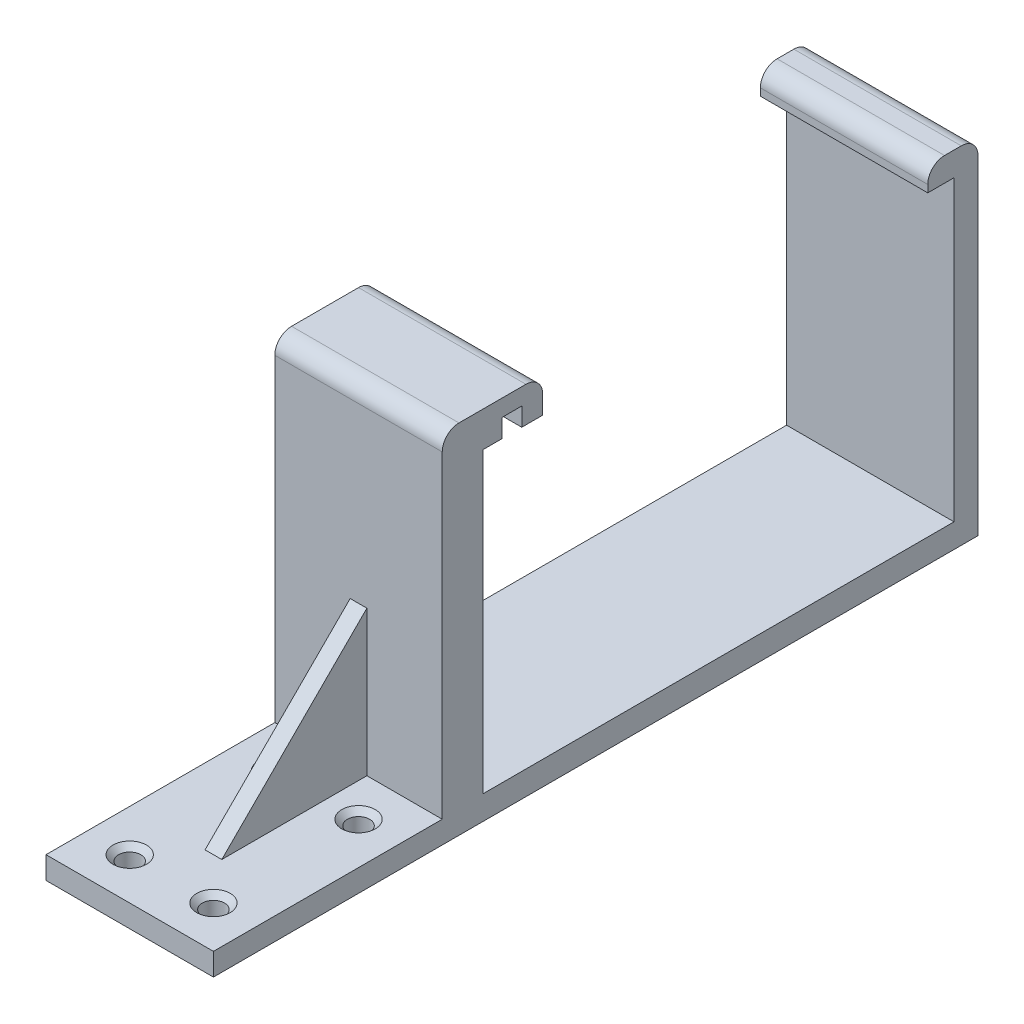
ISO-10303-21;
HEADER;
FILE_DESCRIPTION(('STEP AP214'),'2;1');
FILE_NAME('part.step','',(''),(''),'','','');
FILE_SCHEMA(('AUTOMOTIVE_DESIGN { 1 0 10303 214 1 1 1 1 }'));
ENDSEC;
DATA;
#1=APPLICATION_CONTEXT('core data for automotive mechanical design processes');
#2=APPLICATION_PROTOCOL_DEFINITION('international standard','automotive_design',2000,#1);
#3=PRODUCT_CONTEXT('',#1,'mechanical');
#4=PRODUCT('Part','Part','',(#3));
#5=PRODUCT_RELATED_PRODUCT_CATEGORY('part','',(#4));
#6=PRODUCT_DEFINITION_FORMATION('','',#4);
#7=PRODUCT_DEFINITION_CONTEXT('part definition',#1,'design');
#8=PRODUCT_DEFINITION('design','',#6,#7);
#9=PRODUCT_DEFINITION_SHAPE('','',#8);
#10=(LENGTH_UNIT() NAMED_UNIT(*) SI_UNIT(.MILLI.,.METRE.));
#11=(NAMED_UNIT(*) PLANE_ANGLE_UNIT() SI_UNIT($,.RADIAN.));
#12=(NAMED_UNIT(*) SI_UNIT($,.STERADIAN.) SOLID_ANGLE_UNIT());
#13=UNCERTAINTY_MEASURE_WITH_UNIT(LENGTH_MEASURE(1.E-05),#10,'distance_accuracy_value','');
#14=(GEOMETRIC_REPRESENTATION_CONTEXT(3) GLOBAL_UNCERTAINTY_ASSIGNED_CONTEXT((#13)) GLOBAL_UNIT_ASSIGNED_CONTEXT((#10,
#11,#12)) REPRESENTATION_CONTEXT('',''));
#15=CARTESIAN_POINT('',(0.,0.,0.));
#16=DIRECTION('',(0.,0.,1.));
#17=DIRECTION('',(1.,0.,0.));
#18=AXIS2_PLACEMENT_3D('',#15,#16,#17);
#19=CARTESIAN_POINT('',(0.,4.,0.));
#20=DIRECTION('',(0.,-1.,0.));
#21=DIRECTION('',(0.,0.,-1.));
#22=AXIS2_PLACEMENT_3D('',#19,#20,#21);
#23=PLANE('',#22);
#24=CARTESIAN_POINT('',(7.5,4.,-33.5));
#25=DIRECTION('',(0.,-1.,0.));
#26=DIRECTION('',(0.,0.,-1.));
#27=AXIS2_PLACEMENT_3D('',#24,#25,#26);
#28=CIRCLE('',#27,3.00000000000002);
#29=CARTESIAN_POINT('',(7.5,4.,-36.5));
#30=VERTEX_POINT('',#29);
#31=EDGE_CURVE('E461',#30,#30,#28,.T.);
#32=ORIENTED_EDGE('',*,*,#31,.T.);
#33=EDGE_LOOP('',(#32));
#34=FACE_BOUND('',#33,.T.);
#35=CARTESIAN_POINT('',(22.5,4.,-33.5));
#36=DIRECTION('',(0.,-1.,0.));
#37=DIRECTION('',(0.,0.,-1.));
#38=AXIS2_PLACEMENT_3D('',#35,#36,#37);
#39=CIRCLE('',#38,3.00000000000002);
#40=CARTESIAN_POINT('',(22.5,4.,-36.5));
#41=VERTEX_POINT('',#40);
#42=EDGE_CURVE('E457',#41,#41,#39,.T.);
#43=ORIENTED_EDGE('',*,*,#42,.T.);
#44=EDGE_LOOP('',(#43));
#45=FACE_BOUND('',#44,.T.);
#46=CARTESIAN_POINT('',(22.5,4.,-7.5));
#47=DIRECTION('',(0.,-1.,0.));
#48=DIRECTION('',(0.,0.,-1.));
#49=AXIS2_PLACEMENT_3D('',#46,#47,#48);
#50=CIRCLE('',#49,3.00000000000002);
#51=CARTESIAN_POINT('',(22.5,4.,-10.5));
#52=VERTEX_POINT('',#51);
#53=EDGE_CURVE('E453',#52,#52,#50,.T.);
#54=ORIENTED_EDGE('',*,*,#53,.T.);
#55=EDGE_LOOP('',(#54));
#56=FACE_BOUND('',#55,.T.);
#57=CARTESIAN_POINT('',(7.5,4.,-7.5));
#58=DIRECTION('',(0.,-1.,0.));
#59=DIRECTION('',(0.,0.,-1.));
#60=AXIS2_PLACEMENT_3D('',#57,#58,#59);
#61=CIRCLE('',#60,3.00000000000002);
#62=CARTESIAN_POINT('',(7.5,4.,-10.5));
#63=VERTEX_POINT('',#62);
#64=EDGE_CURVE('E449',#63,#63,#61,.T.);
#65=ORIENTED_EDGE('',*,*,#64,.T.);
#66=EDGE_LOOP('',(#65));
#67=FACE_BOUND('',#66,.T.);
#68=DIRECTION('',(0.,0.,1.));
#69=VECTOR('',#68,1.);
#70=CARTESIAN_POINT('',(13.5,4.,0.));
#71=LINE('',#70,#69);
#72=CARTESIAN_POINT('',(13.5,4.,-41.));
#73=VERTEX_POINT('',#72);
#74=CARTESIAN_POINT('',(13.5,4.,-15.));
#75=VERTEX_POINT('',#74);
#76=EDGE_CURVE('E396',#73,#75,#71,.T.);
#77=ORIENTED_EDGE('',*,*,#76,.F.);
#78=DIRECTION('',(1.,0.,0.));
#79=VECTOR('',#78,1.);
#80=CARTESIAN_POINT('',(30.,4.,-41.));
#81=LINE('',#80,#79);
#82=CARTESIAN_POINT('',(0.,4.,-41.));
#83=VERTEX_POINT('',#82);
#84=EDGE_CURVE('E407',#83,#73,#81,.T.);
#85=ORIENTED_EDGE('',*,*,#84,.F.);
#86=DIRECTION('',(0.,0.,1.));
#87=VECTOR('',#86,1.);
#88=CARTESIAN_POINT('',(0.,4.,0.));
#89=LINE('',#88,#87);
#90=CARTESIAN_POINT('',(0.,4.,0.));
#91=VERTEX_POINT('',#90);
#92=EDGE_CURVE('E418',#83,#91,#89,.T.);
#93=ORIENTED_EDGE('',*,*,#92,.T.);
#94=DIRECTION('',(1.,0.,0.));
#95=VECTOR('',#94,1.);
#96=CARTESIAN_POINT('',(0.,4.,0.));
#97=LINE('',#96,#95);
#98=CARTESIAN_POINT('',(30.,4.,0.));
#99=VERTEX_POINT('',#98);
#100=EDGE_CURVE('E421',#91,#99,#97,.T.);
#101=ORIENTED_EDGE('',*,*,#100,.T.);
#102=DIRECTION('',(0.,0.,-1.));
#103=VECTOR('',#102,1.);
#104=CARTESIAN_POINT('',(30.,4.,0.));
#105=LINE('',#104,#103);
#106=CARTESIAN_POINT('',(30.,4.,-41.));
#107=VERTEX_POINT('',#106);
#108=EDGE_CURVE('E425',#99,#107,#105,.T.);
#109=ORIENTED_EDGE('',*,*,#108,.T.);
#110=CARTESIAN_POINT('',(16.5,4.,-41.));
#111=VERTEX_POINT('',#110);
#112=EDGE_CURVE('E406',#111,#107,#81,.T.);
#113=ORIENTED_EDGE('',*,*,#112,.F.);
#114=DIRECTION('',(0.,0.,-1.));
#115=VECTOR('',#114,1.);
#116=CARTESIAN_POINT('',(16.5,4.,0.));
#117=LINE('',#116,#115);
#118=CARTESIAN_POINT('',(16.5,4.,-15.));
#119=VERTEX_POINT('',#118);
#120=EDGE_CURVE('E392',#119,#111,#117,.T.);
#121=ORIENTED_EDGE('',*,*,#120,.F.);
#122=DIRECTION('',(1.,0.,0.));
#123=VECTOR('',#122,1.);
#124=CARTESIAN_POINT('',(-44.4827560572969,4.,-15.));
#125=LINE('',#124,#123);
#126=EDGE_CURVE('E383',#75,#119,#125,.T.);
#127=ORIENTED_EDGE('',*,*,#126,.F.);
#128=EDGE_LOOP('',(#77,#85,#93,#101,#109,#113,#121,#127));
#129=FACE_BOUND('',#128,.T.);
#130=ADVANCED_FACE('F44',(#34,#45,#56,#67,#129),#23,.F.);
#131=CARTESIAN_POINT('',(30.,62.,-41.));
#132=DIRECTION('',(0.,0.,-1.));
#133=DIRECTION('',(-1.,0.,0.));
#134=AXIS2_PLACEMENT_3D('',#131,#132,#133);
#135=PLANE('',#134);
#136=DIRECTION('',(0.,-1.,0.));
#137=VECTOR('',#136,1.);
#138=CARTESIAN_POINT('',(30.,62.,-41.));
#139=LINE('',#138,#137);
#140=CARTESIAN_POINT('',(30.,61.,-41.));
#141=VERTEX_POINT('',#140);
#142=EDGE_CURVE('E411',#141,#107,#139,.T.);
#143=ORIENTED_EDGE('',*,*,#142,.F.);
#144=DIRECTION('',(1.,0.,0.));
#145=VECTOR('',#144,1.);
#146=CARTESIAN_POINT('',(0.,61.,-41.));
#147=LINE('',#146,#145);
#148=CARTESIAN_POINT('',(0.,61.,-41.));
#149=VERTEX_POINT('',#148);
#150=EDGE_CURVE('E496',#141,#149,#147,.F.);
#151=ORIENTED_EDGE('',*,*,#150,.T.);
#152=DIRECTION('',(0.,-1.,0.));
#153=VECTOR('',#152,1.);
#154=CARTESIAN_POINT('',(0.,62.,-41.));
#155=LINE('',#154,#153);
#156=EDGE_CURVE('E414',#149,#83,#155,.T.);
#157=ORIENTED_EDGE('',*,*,#156,.T.);
#158=ORIENTED_EDGE('',*,*,#84,.T.);
#159=DIRECTION('',(0.,-1.,0.));
#160=VECTOR('',#159,1.);
#161=CARTESIAN_POINT('',(13.5,45.,-41.));
#162=LINE('',#161,#160);
#163=CARTESIAN_POINT('',(13.5,30.,-41.));
#164=VERTEX_POINT('',#163);
#165=EDGE_CURVE('E400',#164,#73,#162,.T.);
#166=ORIENTED_EDGE('',*,*,#165,.F.);
#167=DIRECTION('',(1.,0.,0.));
#168=VECTOR('',#167,1.);
#169=CARTESIAN_POINT('',(-44.4827560572969,30.,-41.));
#170=LINE('',#169,#168);
#171=CARTESIAN_POINT('',(16.5,30.,-41.));
#172=VERTEX_POINT('',#171);
#173=EDGE_CURVE('E384',#164,#172,#170,.T.);
#174=ORIENTED_EDGE('',*,*,#173,.T.);
#175=DIRECTION('',(0.,-1.,0.));
#176=VECTOR('',#175,1.);
#177=CARTESIAN_POINT('',(16.5,45.,-41.));
#178=LINE('',#177,#176);
#179=EDGE_CURVE('E403',#172,#111,#178,.T.);
#180=ORIENTED_EDGE('',*,*,#179,.T.);
#181=ORIENTED_EDGE('',*,*,#112,.T.);
#182=EDGE_LOOP('',(#143,#151,#157,#158,#166,#174,#180,#181));
#183=FACE_BOUND('',#182,.T.);
#184=ADVANCED_FACE('F613',(#183),#135,.F.);
#185=CARTESIAN_POINT('',(0.,4.,0.));
#186=DIRECTION('',(1.,0.,0.));
#187=DIRECTION('',(0.,0.,-1.));
#188=AXIS2_PLACEMENT_3D('',#185,#186,#187);
#189=PLANE('',#188);
#190=ORIENTED_EDGE('',*,*,#156,.F.);
#191=CARTESIAN_POINT('',(0.,61.,-44.));
#192=DIRECTION('',(1.,0.,0.));
#193=DIRECTION('',(0.,0.,-1.));
#194=AXIS2_PLACEMENT_3D('',#191,#192,#193);
#195=CIRCLE('',#194,3.);
#196=CARTESIAN_POINT('',(0.,64.,-44.));
#197=VERTEX_POINT('',#196);
#198=EDGE_CURVE('E506',#149,#197,#195,.F.);
#199=ORIENTED_EDGE('',*,*,#198,.T.);
#200=DIRECTION('',(0.,0.,-1.));
#201=VECTOR('',#200,1.);
#202=CARTESIAN_POINT('',(0.,64.,-41.));
#203=LINE('',#202,#201);
#204=CARTESIAN_POINT('',(0.,64.,-56.));
#205=VERTEX_POINT('',#204);
#206=EDGE_CURVE('E307',#197,#205,#203,.T.);
#207=ORIENTED_EDGE('',*,*,#206,.T.);
#208=CARTESIAN_POINT('',(0.,61.,-56.));
#209=DIRECTION('',(1.,0.,0.));
#210=DIRECTION('',(0.,0.,-1.));
#211=AXIS2_PLACEMENT_3D('',#208,#209,#210);
#212=CIRCLE('',#211,3.);
#213=CARTESIAN_POINT('',(0.,61.,-59.));
#214=VERTEX_POINT('',#213);
#215=EDGE_CURVE('E60',#205,#214,#212,.F.);
#216=ORIENTED_EDGE('',*,*,#215,.T.);
#217=DIRECTION('',(0.,1.,0.));
#218=VECTOR('',#217,1.);
#219=CARTESIAN_POINT('',(0.,58.,-59.));
#220=LINE('',#219,#218);
#221=CARTESIAN_POINT('',(0.,57.7,-59.));
#222=VERTEX_POINT('',#221);
#223=EDGE_CURVE('E333',#222,#214,#220,.T.);
#224=ORIENTED_EDGE('',*,*,#223,.F.);
#225=DIRECTION('',(0.,0.,1.));
#226=VECTOR('',#225,1.);
#227=CARTESIAN_POINT('',(0.,57.7,-55.25));
#228=LINE('',#227,#226);
#229=CARTESIAN_POINT('',(0.,57.7,-55.25));
#230=VERTEX_POINT('',#229);
#231=EDGE_CURVE('E246',#222,#230,#228,.T.);
#232=ORIENTED_EDGE('',*,*,#231,.T.);
#233=DIRECTION('',(0.,-1.,0.));
#234=VECTOR('',#233,1.);
#235=CARTESIAN_POINT('',(0.,58.,-55.25));
#236=LINE('',#235,#234);
#237=CARTESIAN_POINT('',(0.,61.,-55.25));
#238=VERTEX_POINT('',#237);
#239=EDGE_CURVE('E241',#238,#230,#236,.T.);
#240=ORIENTED_EDGE('',*,*,#239,.F.);
#241=DIRECTION('',(0.,0.,-1.));
#242=VECTOR('',#241,1.);
#243=CARTESIAN_POINT('',(0.,61.,-55.25));
#244=LINE('',#243,#242);
#245=CARTESIAN_POINT('',(0.,61.,-51.75));
#246=VERTEX_POINT('',#245);
#247=EDGE_CURVE('E319',#246,#238,#244,.T.);
#248=ORIENTED_EDGE('',*,*,#247,.F.);
#249=DIRECTION('',(0.,1.,0.));
#250=VECTOR('',#249,1.);
#251=CARTESIAN_POINT('',(0.,58.,-51.75));
#252=LINE('',#251,#250);
#253=CARTESIAN_POINT('',(0.,57.7,-51.75));
#254=VERTEX_POINT('',#253);
#255=EDGE_CURVE('E310',#254,#246,#252,.T.);
#256=ORIENTED_EDGE('',*,*,#255,.F.);
#257=DIRECTION('',(0.,0.,1.));
#258=VECTOR('',#257,1.);
#259=CARTESIAN_POINT('',(0.,57.7,-48.3));
#260=LINE('',#259,#258);
#261=CARTESIAN_POINT('',(0.,57.7,-48.3));
#262=VERTEX_POINT('',#261);
#263=EDGE_CURVE('E250',#254,#262,#260,.T.);
#264=ORIENTED_EDGE('',*,*,#263,.T.);
#265=DIRECTION('',(0.,-1.,0.));
#266=VECTOR('',#265,1.);
#267=CARTESIAN_POINT('',(0.,4.29999999999999,-48.3));
#268=LINE('',#267,#266);
#269=CARTESIAN_POINT('',(0.,4.29999999999999,-48.3));
#270=VERTEX_POINT('',#269);
#271=EDGE_CURVE('E273',#262,#270,#268,.T.);
#272=ORIENTED_EDGE('',*,*,#271,.T.);
#273=DIRECTION('',(0.,0.,-1.));
#274=VECTOR('',#273,1.);
#275=CARTESIAN_POINT('',(0.,4.3,-132.7));
#276=LINE('',#275,#274);
#277=CARTESIAN_POINT('',(0.,4.3,-132.7));
#278=VERTEX_POINT('',#277);
#279=EDGE_CURVE('E277',#270,#278,#276,.T.);
#280=ORIENTED_EDGE('',*,*,#279,.T.);
#281=DIRECTION('',(0.,1.,0.));
#282=VECTOR('',#281,1.);
#283=CARTESIAN_POINT('',(0.,57.7,-132.7));
#284=LINE('',#283,#282);
#285=CARTESIAN_POINT('',(0.,57.7,-132.7));
#286=VERTEX_POINT('',#285);
#287=EDGE_CURVE('E281',#278,#286,#284,.T.);
#288=ORIENTED_EDGE('',*,*,#287,.T.);
#289=DIRECTION('',(0.,0.,1.));
#290=VECTOR('',#289,1.);
#291=CARTESIAN_POINT('',(0.,57.7,-128.));
#292=LINE('',#291,#290);
#293=CARTESIAN_POINT('',(0.,57.7,-128.));
#294=VERTEX_POINT('',#293);
#295=EDGE_CURVE('E285',#286,#294,#292,.T.);
#296=ORIENTED_EDGE('',*,*,#295,.T.);
#297=DIRECTION('',(0.,-1.,0.));
#298=VECTOR('',#297,1.);
#299=CARTESIAN_POINT('',(0.,62.,-128.));
#300=LINE('',#299,#298);
#301=CARTESIAN_POINT('',(0.,59.,-128.));
#302=VERTEX_POINT('',#301);
#303=EDGE_CURVE('E344',#302,#294,#300,.T.);
#304=ORIENTED_EDGE('',*,*,#303,.F.);
#305=CARTESIAN_POINT('',(0.,59.,-131.));
#306=DIRECTION('',(1.,0.,0.));
#307=DIRECTION('',(0.,0.,-1.));
#308=AXIS2_PLACEMENT_3D('',#305,#306,#307);
#309=CIRCLE('',#308,3.);
#310=CARTESIAN_POINT('',(0.,62.,-131.));
#311=VERTEX_POINT('',#310);
#312=EDGE_CURVE('E501',#302,#311,#309,.F.);
#313=ORIENTED_EDGE('',*,*,#312,.T.);
#314=DIRECTION('',(0.,0.,1.));
#315=VECTOR('',#314,1.);
#316=CARTESIAN_POINT('',(0.,62.,-137.));
#317=LINE('',#316,#315);
#318=CARTESIAN_POINT('',(0.,62.,-134.));
#319=VERTEX_POINT('',#318);
#320=EDGE_CURVE('E340',#319,#311,#317,.T.);
#321=ORIENTED_EDGE('',*,*,#320,.F.);
#322=CARTESIAN_POINT('',(0.,59.,-134.));
#323=DIRECTION('',(1.,0.,0.));
#324=DIRECTION('',(0.,0.,-1.));
#325=AXIS2_PLACEMENT_3D('',#322,#323,#324);
#326=CIRCLE('',#325,3.);
#327=CARTESIAN_POINT('',(0.,59.,-137.));
#328=VERTEX_POINT('',#327);
#329=EDGE_CURVE('E67',#319,#328,#326,.F.);
#330=ORIENTED_EDGE('',*,*,#329,.T.);
#331=DIRECTION('',(0.,1.,0.));
#332=VECTOR('',#331,1.);
#333=CARTESIAN_POINT('',(0.,0.,-137.));
#334=LINE('',#333,#332);
#335=CARTESIAN_POINT('',(0.,0.,-137.));
#336=VERTEX_POINT('',#335);
#337=EDGE_CURVE('E336',#336,#328,#334,.T.);
#338=ORIENTED_EDGE('',*,*,#337,.F.);
#339=DIRECTION('',(0.,0.,1.));
#340=VECTOR('',#339,1.);
#341=CARTESIAN_POINT('',(0.,0.,0.));
#342=LINE('',#341,#340);
#343=CARTESIAN_POINT('',(0.,0.,0.));
#344=VERTEX_POINT('',#343);
#345=EDGE_CURVE('E417',#336,#344,#342,.T.);
#346=ORIENTED_EDGE('',*,*,#345,.T.);
#347=DIRECTION('',(0.,-1.,0.));
#348=VECTOR('',#347,1.);
#349=CARTESIAN_POINT('',(0.,4.,0.));
#350=LINE('',#349,#348);
#351=EDGE_CURVE('E441',#91,#344,#350,.T.);
#352=ORIENTED_EDGE('',*,*,#351,.F.);
#353=ORIENTED_EDGE('',*,*,#92,.F.);
#354=EDGE_LOOP('',(#190,#199,#207,#216,#224,#232,#240,#248,#256,#264,#272,#280,#288,#296,#304,
#313,#321,#330,#338,#346,#352,#353));
#355=FACE_BOUND('',#354,.T.);
#356=ADVANCED_FACE('F529',(#355),#189,.F.);
#357=CARTESIAN_POINT('',(0.,4.,0.));
#358=DIRECTION('',(0.,0.,-1.));
#359=DIRECTION('',(-1.,0.,0.));
#360=AXIS2_PLACEMENT_3D('',#357,#358,#359);
#361=PLANE('',#360);
#362=DIRECTION('',(0.,-1.,0.));
#363=VECTOR('',#362,1.);
#364=CARTESIAN_POINT('',(30.,4.,0.));
#365=LINE('',#364,#363);
#366=CARTESIAN_POINT('',(30.,0.,0.));
#367=VERTEX_POINT('',#366);
#368=EDGE_CURVE('E429',#99,#367,#365,.T.);
#369=ORIENTED_EDGE('',*,*,#368,.F.);
#370=ORIENTED_EDGE('',*,*,#100,.F.);
#371=ORIENTED_EDGE('',*,*,#351,.T.);
#372=DIRECTION('',(1.,0.,0.));
#373=VECTOR('',#372,1.);
#374=CARTESIAN_POINT('',(0.,0.,0.));
#375=LINE('',#374,#373);
#376=EDGE_CURVE('E433',#344,#367,#375,.T.);
#377=ORIENTED_EDGE('',*,*,#376,.T.);
#378=EDGE_LOOP('',(#369,#370,#371,#377));
#379=FACE_BOUND('',#378,.T.);
#380=ADVANCED_FACE('F551',(#379),#361,.F.);
#381=CARTESIAN_POINT('',(30.,4.,0.));
#382=DIRECTION('',(-1.,0.,0.));
#383=DIRECTION('',(0.,0.,1.));
#384=AXIS2_PLACEMENT_3D('',#381,#382,#383);
#385=PLANE('',#384);
#386=DIRECTION('',(0.,0.,1.));
#387=VECTOR('',#386,1.);
#388=CARTESIAN_POINT('',(30.,64.,-41.));
#389=LINE('',#388,#387);
#390=CARTESIAN_POINT('',(30.,64.,-56.));
#391=VERTEX_POINT('',#390);
#392=CARTESIAN_POINT('',(30.,64.,-44.));
#393=VERTEX_POINT('',#392);
#394=EDGE_CURVE('E269',#391,#393,#389,.T.);
#395=ORIENTED_EDGE('',*,*,#394,.T.);
#396=CARTESIAN_POINT('',(30.,61.,-44.));
#397=DIRECTION('',(-1.,0.,0.));
#398=DIRECTION('',(0.,0.,1.));
#399=AXIS2_PLACEMENT_3D('',#396,#397,#398);
#400=CIRCLE('',#399,3.);
#401=EDGE_CURVE('E493',#393,#141,#400,.F.);
#402=ORIENTED_EDGE('',*,*,#401,.T.);
#403=ORIENTED_EDGE('',*,*,#142,.T.);
#404=ORIENTED_EDGE('',*,*,#108,.F.);
#405=ORIENTED_EDGE('',*,*,#368,.T.);
#406=DIRECTION('',(0.,0.,-1.));
#407=VECTOR('',#406,1.);
#408=CARTESIAN_POINT('',(30.,0.,0.));
#409=LINE('',#408,#407);
#410=CARTESIAN_POINT('',(30.,0.,-137.));
#411=VERTEX_POINT('',#410);
#412=EDGE_CURVE('E422',#367,#411,#409,.T.);
#413=ORIENTED_EDGE('',*,*,#412,.T.);
#414=DIRECTION('',(0.,1.,0.));
#415=VECTOR('',#414,1.);
#416=CARTESIAN_POINT('',(30.,0.,-137.));
#417=LINE('',#416,#415);
#418=CARTESIAN_POINT('',(30.,59.,-137.));
#419=VERTEX_POINT('',#418);
#420=EDGE_CURVE('E350',#411,#419,#417,.T.);
#421=ORIENTED_EDGE('',*,*,#420,.T.);
#422=CARTESIAN_POINT('',(30.,59.,-134.));
#423=DIRECTION('',(-1.,0.,0.));
#424=DIRECTION('',(0.,0.,1.));
#425=AXIS2_PLACEMENT_3D('',#422,#423,#424);
#426=CIRCLE('',#425,3.);
#427=CARTESIAN_POINT('',(30.,62.,-134.));
#428=VERTEX_POINT('',#427);
#429=EDGE_CURVE('E484',#419,#428,#426,.F.);
#430=ORIENTED_EDGE('',*,*,#429,.T.);
#431=DIRECTION('',(0.,0.,1.));
#432=VECTOR('',#431,1.);
#433=CARTESIAN_POINT('',(30.,62.,-137.));
#434=LINE('',#433,#432);
#435=CARTESIAN_POINT('',(30.,62.,-131.));
#436=VERTEX_POINT('',#435);
#437=EDGE_CURVE('E354',#428,#436,#434,.T.);
#438=ORIENTED_EDGE('',*,*,#437,.T.);
#439=CARTESIAN_POINT('',(30.,59.,-131.));
#440=DIRECTION('',(-1.,0.,0.));
#441=DIRECTION('',(0.,0.,1.));
#442=AXIS2_PLACEMENT_3D('',#439,#440,#441);
#443=CIRCLE('',#442,3.);
#444=CARTESIAN_POINT('',(30.,59.,-128.));
#445=VERTEX_POINT('',#444);
#446=EDGE_CURVE('E487',#436,#445,#443,.F.);
#447=ORIENTED_EDGE('',*,*,#446,.T.);
#448=DIRECTION('',(0.,-1.,0.));
#449=VECTOR('',#448,1.);
#450=CARTESIAN_POINT('',(30.,62.,-128.));
#451=LINE('',#450,#449);
#452=CARTESIAN_POINT('',(30.,57.7,-128.));
#453=VERTEX_POINT('',#452);
#454=EDGE_CURVE('E337',#445,#453,#451,.T.);
#455=ORIENTED_EDGE('',*,*,#454,.T.);
#456=DIRECTION('',(0.,0.,-1.));
#457=VECTOR('',#456,1.);
#458=CARTESIAN_POINT('',(30.,57.7,-128.));
#459=LINE('',#458,#457);
#460=CARTESIAN_POINT('',(30.,57.7,-132.7));
#461=VERTEX_POINT('',#460);
#462=EDGE_CURVE('E266',#453,#461,#459,.T.);
#463=ORIENTED_EDGE('',*,*,#462,.T.);
#464=DIRECTION('',(0.,-1.,0.));
#465=VECTOR('',#464,1.);
#466=CARTESIAN_POINT('',(30.,57.7,-132.7));
#467=LINE('',#466,#465);
#468=CARTESIAN_POINT('',(30.,4.3,-132.7));
#469=VERTEX_POINT('',#468);
#470=EDGE_CURVE('E263',#461,#469,#467,.T.);
#471=ORIENTED_EDGE('',*,*,#470,.T.);
#472=DIRECTION('',(0.,0.,1.));
#473=VECTOR('',#472,1.);
#474=CARTESIAN_POINT('',(30.,4.3,-132.7));
#475=LINE('',#474,#473);
#476=CARTESIAN_POINT('',(30.,4.29999999999999,-48.3));
#477=VERTEX_POINT('',#476);
#478=EDGE_CURVE('E260',#469,#477,#475,.T.);
#479=ORIENTED_EDGE('',*,*,#478,.T.);
#480=DIRECTION('',(0.,1.,0.));
#481=VECTOR('',#480,1.);
#482=CARTESIAN_POINT('',(30.,4.29999999999999,-48.3));
#483=LINE('',#482,#481);
#484=CARTESIAN_POINT('',(30.,57.7,-48.3));
#485=VERTEX_POINT('',#484);
#486=EDGE_CURVE('E256',#477,#485,#483,.T.);
#487=ORIENTED_EDGE('',*,*,#486,.T.);
#488=DIRECTION('',(0.,0.,-1.));
#489=VECTOR('',#488,1.);
#490=CARTESIAN_POINT('',(30.,57.7,-48.3));
#491=LINE('',#490,#489);
#492=CARTESIAN_POINT('',(30.,57.7,-51.75));
#493=VERTEX_POINT('',#492);
#494=EDGE_CURVE('E252',#485,#493,#491,.T.);
#495=ORIENTED_EDGE('',*,*,#494,.T.);
#496=DIRECTION('',(0.,-1.,0.));
#497=VECTOR('',#496,1.);
#498=CARTESIAN_POINT('',(30.,58.,-51.75));
#499=LINE('',#498,#497);
#500=CARTESIAN_POINT('',(30.,61.,-51.75));
#501=VERTEX_POINT('',#500);
#502=EDGE_CURVE('E227',#501,#493,#499,.T.);
#503=ORIENTED_EDGE('',*,*,#502,.F.);
#504=DIRECTION('',(0.,0.,1.));
#505=VECTOR('',#504,1.);
#506=CARTESIAN_POINT('',(30.,61.,-55.25));
#507=LINE('',#506,#505);
#508=CARTESIAN_POINT('',(30.,61.,-55.25));
#509=VERTEX_POINT('',#508);
#510=EDGE_CURVE('E222',#509,#501,#507,.T.);
#511=ORIENTED_EDGE('',*,*,#510,.F.);
#512=DIRECTION('',(0.,1.,0.));
#513=VECTOR('',#512,1.);
#514=CARTESIAN_POINT('',(30.,58.,-55.25));
#515=LINE('',#514,#513);
#516=CARTESIAN_POINT('',(30.,57.7,-55.25));
#517=VERTEX_POINT('',#516);
#518=EDGE_CURVE('E214',#517,#509,#515,.T.);
#519=ORIENTED_EDGE('',*,*,#518,.F.);
#520=DIRECTION('',(0.,0.,-1.));
#521=VECTOR('',#520,1.);
#522=CARTESIAN_POINT('',(30.,57.7,-55.25));
#523=LINE('',#522,#521);
#524=CARTESIAN_POINT('',(30.,57.7,-59.));
#525=VERTEX_POINT('',#524);
#526=EDGE_CURVE('E219',#517,#525,#523,.T.);
#527=ORIENTED_EDGE('',*,*,#526,.T.);
#528=DIRECTION('',(0.,1.,0.));
#529=VECTOR('',#528,1.);
#530=CARTESIAN_POINT('',(30.,58.,-59.));
#531=LINE('',#530,#529);
#532=CARTESIAN_POINT('',(30.,61.,-59.));
#533=VERTEX_POINT('',#532);
#534=EDGE_CURVE('E332',#525,#533,#531,.T.);
#535=ORIENTED_EDGE('',*,*,#534,.T.);
#536=CARTESIAN_POINT('',(30.,61.,-56.));
#537=DIRECTION('',(-1.,0.,0.));
#538=DIRECTION('',(0.,0.,1.));
#539=AXIS2_PLACEMENT_3D('',#536,#537,#538);
#540=CIRCLE('',#539,3.);
#541=EDGE_CURVE('E490',#533,#391,#540,.F.);
#542=ORIENTED_EDGE('',*,*,#541,.T.);
#543=EDGE_LOOP('',(#395,#402,#403,#404,#405,#413,#421,#430,#438,#447,#455,#463,#471,#479,#487,
#495,#503,#511,#519,#527,#535,#542));
#544=FACE_BOUND('',#543,.T.);
#545=ADVANCED_FACE('F217',(#544),#385,.F.);
#546=CARTESIAN_POINT('',(0.,0.,0.));
#547=DIRECTION('',(0.,-1.,0.));
#548=DIRECTION('',(0.,0.,-1.));
#549=AXIS2_PLACEMENT_3D('',#546,#547,#548);
#550=PLANE('',#549);
#551=CARTESIAN_POINT('',(7.5,0.,-33.5));
#552=DIRECTION('',(0.,-1.,0.));
#553=DIRECTION('',(0.,0.,-1.));
#554=AXIS2_PLACEMENT_3D('',#551,#552,#553);
#555=CIRCLE('',#554,2.);
#556=CARTESIAN_POINT('',(7.5,0.,-35.5));
#557=VERTEX_POINT('',#556);
#558=EDGE_CURVE('E363',#557,#557,#555,.F.);
#559=ORIENTED_EDGE('',*,*,#558,.T.);
#560=EDGE_LOOP('',(#559));
#561=FACE_BOUND('',#560,.T.);
#562=CARTESIAN_POINT('',(22.5,0.,-33.5));
#563=DIRECTION('',(0.,-1.,0.));
#564=DIRECTION('',(0.,0.,-1.));
#565=AXIS2_PLACEMENT_3D('',#562,#563,#564);
#566=CIRCLE('',#565,2.);
#567=CARTESIAN_POINT('',(22.5,0.,-35.5));
#568=VERTEX_POINT('',#567);
#569=EDGE_CURVE('E369',#568,#568,#566,.F.);
#570=ORIENTED_EDGE('',*,*,#569,.T.);
#571=EDGE_LOOP('',(#570));
#572=FACE_BOUND('',#571,.T.);
#573=CARTESIAN_POINT('',(22.5,0.,-7.5));
#574=DIRECTION('',(0.,-1.,0.));
#575=DIRECTION('',(0.,0.,-1.));
#576=AXIS2_PLACEMENT_3D('',#573,#574,#575);
#577=CIRCLE('',#576,2.);
#578=CARTESIAN_POINT('',(22.5,0.,-9.5));
#579=VERTEX_POINT('',#578);
#580=EDGE_CURVE('E364',#579,#579,#577,.F.);
#581=ORIENTED_EDGE('',*,*,#580,.T.);
#582=EDGE_LOOP('',(#581));
#583=FACE_BOUND('',#582,.T.);
#584=CARTESIAN_POINT('',(7.5,0.,-7.5));
#585=DIRECTION('',(0.,-1.,0.));
#586=DIRECTION('',(0.,0.,-1.));
#587=AXIS2_PLACEMENT_3D('',#584,#585,#586);
#588=CIRCLE('',#587,2.);
#589=CARTESIAN_POINT('',(7.5,0.,-9.5));
#590=VERTEX_POINT('',#589);
#591=EDGE_CURVE('E368',#590,#590,#588,.F.);
#592=ORIENTED_EDGE('',*,*,#591,.T.);
#593=EDGE_LOOP('',(#592));
#594=FACE_BOUND('',#593,.T.);
#595=ORIENTED_EDGE('',*,*,#345,.F.);
#596=DIRECTION('',(1.,0.,0.));
#597=VECTOR('',#596,1.);
#598=CARTESIAN_POINT('',(0.,0.,-137.));
#599=LINE('',#598,#597);
#600=EDGE_CURVE('E347',#336,#411,#599,.T.);
#601=ORIENTED_EDGE('',*,*,#600,.T.);
#602=ORIENTED_EDGE('',*,*,#412,.F.);
#603=ORIENTED_EDGE('',*,*,#376,.F.);
#604=EDGE_LOOP('',(#595,#601,#602,#603));
#605=FACE_BOUND('',#604,.T.);
#606=ADVANCED_FACE('F546',(#561,#572,#583,#594,#605),#550,.T.);
#607=CARTESIAN_POINT('',(16.5,45.,0.));
#608=DIRECTION('',(-1.,0.,0.));
#609=DIRECTION('',(0.,0.,1.));
#610=AXIS2_PLACEMENT_3D('',#607,#608,#609);
#611=PLANE('',#610);
#612=ORIENTED_EDGE('',*,*,#179,.F.);
#613=DIRECTION('',(0.,0.707106781186547,-0.707106781186548));
#614=VECTOR('',#613,1.);
#615=CARTESIAN_POINT('',(16.5,4.,-15.));
#616=LINE('',#615,#614);
#617=EDGE_CURVE('E379',#119,#172,#616,.T.);
#618=ORIENTED_EDGE('',*,*,#617,.F.);
#619=ORIENTED_EDGE('',*,*,#120,.T.);
#620=EDGE_LOOP('',(#612,#618,#619));
#621=FACE_BOUND('',#620,.T.);
#622=ADVANCED_FACE('F624',(#621),#611,.F.);
#623=CARTESIAN_POINT('',(13.5,45.,0.));
#624=DIRECTION('',(1.,0.,0.));
#625=DIRECTION('',(0.,0.,-1.));
#626=AXIS2_PLACEMENT_3D('',#623,#624,#625);
#627=PLANE('',#626);
#628=ORIENTED_EDGE('',*,*,#76,.T.);
#629=DIRECTION('',(0.,-0.707106781186547,0.707106781186548));
#630=VECTOR('',#629,1.);
#631=CARTESIAN_POINT('',(13.5,3.99999999999999,-15.));
#632=LINE('',#631,#630);
#633=EDGE_CURVE('E387',#164,#75,#632,.T.);
#634=ORIENTED_EDGE('',*,*,#633,.F.);
#635=ORIENTED_EDGE('',*,*,#165,.T.);
#636=EDGE_LOOP('',(#628,#634,#635));
#637=FACE_BOUND('',#636,.T.);
#638=ADVANCED_FACE('F898',(#637),#627,.F.);
#639=CARTESIAN_POINT('',(-44.4827560572969,4.,-15.));
#640=DIRECTION('',(0.,-0.707106781186548,-0.707106781186547));
#641=DIRECTION('',(0.,0.707106781186547,-0.707106781186548));
#642=AXIS2_PLACEMENT_3D('',#639,#640,#641);
#643=PLANE('',#642);
#644=ORIENTED_EDGE('',*,*,#633,.T.);
#645=ORIENTED_EDGE('',*,*,#126,.T.);
#646=ORIENTED_EDGE('',*,*,#617,.T.);
#647=ORIENTED_EDGE('',*,*,#173,.F.);
#648=EDGE_LOOP('',(#644,#645,#646,#647));
#649=FACE_BOUND('',#648,.T.);
#650=ADVANCED_FACE('F881',(#649),#643,.F.);
#651=CARTESIAN_POINT('',(7.5,-5.65685424949238,-7.5));
#652=DIRECTION('',(0.,1.,0.));
#653=DIRECTION('',(0.,0.,1.));
#654=AXIS2_PLACEMENT_3D('',#651,#652,#653);
#655=CYLINDRICAL_SURFACE('',#654,2.);
#656=CARTESIAN_POINT('',(7.5,2.99999999999998,-7.5));
#657=DIRECTION('',(0.,-1.,0.));
#658=DIRECTION('',(0.,0.,-1.));
#659=AXIS2_PLACEMENT_3D('',#656,#657,#658);
#660=CIRCLE('',#659,2.);
#661=CARTESIAN_POINT('',(7.5,2.99999999999998,-9.5));
#662=VERTEX_POINT('',#661);
#663=EDGE_CURVE('E473',#662,#662,#660,.F.);
#664=ORIENTED_EDGE('',*,*,#663,.T.);
#665=EDGE_LOOP('',(#664));
#666=FACE_BOUND('',#665,.T.);
#667=ORIENTED_EDGE('',*,*,#591,.F.);
#668=EDGE_LOOP('',(#667));
#669=FACE_BOUND('',#668,.T.);
#670=ADVANCED_FACE('F872',(#666,#669),#655,.F.);
#671=CARTESIAN_POINT('',(22.5,-5.65685424949238,-7.5));
#672=DIRECTION('',(0.,1.,0.));
#673=DIRECTION('',(0.,0.,1.));
#674=AXIS2_PLACEMENT_3D('',#671,#672,#673);
#675=CYLINDRICAL_SURFACE('',#674,2.);
#676=CARTESIAN_POINT('',(22.5,2.99999999999998,-7.5));
#677=DIRECTION('',(0.,-1.,0.));
#678=DIRECTION('',(0.,0.,-1.));
#679=AXIS2_PLACEMENT_3D('',#676,#677,#678);
#680=CIRCLE('',#679,2.);
#681=CARTESIAN_POINT('',(22.5,2.99999999999998,-9.5));
#682=VERTEX_POINT('',#681);
#683=EDGE_CURVE('E469',#682,#682,#680,.F.);
#684=ORIENTED_EDGE('',*,*,#683,.T.);
#685=EDGE_LOOP('',(#684));
#686=FACE_BOUND('',#685,.T.);
#687=ORIENTED_EDGE('',*,*,#580,.F.);
#688=EDGE_LOOP('',(#687));
#689=FACE_BOUND('',#688,.T.);
#690=ADVANCED_FACE('F862',(#686,#689),#675,.F.);
#691=CARTESIAN_POINT('',(22.5,-5.65685424949238,-33.5));
#692=DIRECTION('',(0.,1.,0.));
#693=DIRECTION('',(0.,0.,1.));
#694=AXIS2_PLACEMENT_3D('',#691,#692,#693);
#695=CYLINDRICAL_SURFACE('',#694,2.);
#696=CARTESIAN_POINT('',(22.5,2.99999999999999,-33.5));
#697=DIRECTION('',(0.,-1.,0.));
#698=DIRECTION('',(0.,0.,-1.));
#699=AXIS2_PLACEMENT_3D('',#696,#697,#698);
#700=CIRCLE('',#699,2.);
#701=CARTESIAN_POINT('',(22.5,2.99999999999999,-35.5));
#702=VERTEX_POINT('',#701);
#703=EDGE_CURVE('E465',#702,#702,#700,.F.);
#704=ORIENTED_EDGE('',*,*,#703,.T.);
#705=EDGE_LOOP('',(#704));
#706=FACE_BOUND('',#705,.T.);
#707=ORIENTED_EDGE('',*,*,#569,.F.);
#708=EDGE_LOOP('',(#707));
#709=FACE_BOUND('',#708,.T.);
#710=ADVANCED_FACE('F852',(#706,#709),#695,.F.);
#711=CARTESIAN_POINT('',(7.5,-5.65685424949238,-33.5));
#712=DIRECTION('',(0.,1.,0.));
#713=DIRECTION('',(0.,0.,1.));
#714=AXIS2_PLACEMENT_3D('',#711,#712,#713);
#715=CYLINDRICAL_SURFACE('',#714,2.);
#716=CARTESIAN_POINT('',(7.5,2.99999999999998,-33.5));
#717=DIRECTION('',(0.,-1.,0.));
#718=DIRECTION('',(0.,0.,-1.));
#719=AXIS2_PLACEMENT_3D('',#716,#717,#718);
#720=CIRCLE('',#719,2.);
#721=CARTESIAN_POINT('',(7.5,2.99999999999998,-35.5));
#722=VERTEX_POINT('',#721);
#723=EDGE_CURVE('E445',#722,#722,#720,.F.);
#724=ORIENTED_EDGE('',*,*,#723,.T.);
#725=EDGE_LOOP('',(#724));
#726=FACE_BOUND('',#725,.T.);
#727=ORIENTED_EDGE('',*,*,#558,.F.);
#728=EDGE_LOOP('',(#727));
#729=FACE_BOUND('',#728,.T.);
#730=ADVANCED_FACE('F640',(#726,#729),#715,.F.);
#731=CARTESIAN_POINT('',(7.5,2.99999999999998,-33.5));
#732=DIRECTION('',(0.,1.,0.));
#733=DIRECTION('',(0.,0.,1.));
#734=AXIS2_PLACEMENT_3D('',#731,#732,#733);
#735=CONICAL_SURFACE('',#734,2.,0.785398163397454);
#736=ORIENTED_EDGE('',*,*,#31,.F.);
#737=EDGE_LOOP('',(#736));
#738=FACE_BOUND('',#737,.T.);
#739=ORIENTED_EDGE('',*,*,#723,.F.);
#740=EDGE_LOOP('',(#739));
#741=FACE_BOUND('',#740,.T.);
#742=ADVANCED_FACE('F633',(#738,#741),#735,.F.);
#743=CARTESIAN_POINT('',(22.5,2.99999999999999,-33.5));
#744=DIRECTION('',(0.,1.,0.));
#745=DIRECTION('',(0.,0.,1.));
#746=AXIS2_PLACEMENT_3D('',#743,#744,#745);
#747=CONICAL_SURFACE('',#746,2.,0.785398163397452);
#748=ORIENTED_EDGE('',*,*,#42,.F.);
#749=EDGE_LOOP('',(#748));
#750=FACE_BOUND('',#749,.T.);
#751=ORIENTED_EDGE('',*,*,#703,.F.);
#752=EDGE_LOOP('',(#751));
#753=FACE_BOUND('',#752,.T.);
#754=ADVANCED_FACE('F639',(#750,#753),#747,.F.);
#755=CARTESIAN_POINT('',(22.5,2.99999999999998,-7.5));
#756=DIRECTION('',(0.,1.,0.));
#757=DIRECTION('',(0.,0.,1.));
#758=AXIS2_PLACEMENT_3D('',#755,#756,#757);
#759=CONICAL_SURFACE('',#758,2.,0.785398163397452);
#760=ORIENTED_EDGE('',*,*,#53,.F.);
#761=EDGE_LOOP('',(#760));
#762=FACE_BOUND('',#761,.T.);
#763=ORIENTED_EDGE('',*,*,#683,.F.);
#764=EDGE_LOOP('',(#763));
#765=FACE_BOUND('',#764,.T.);
#766=ADVANCED_FACE('F647',(#762,#765),#759,.F.);
#767=CARTESIAN_POINT('',(7.5,2.99999999999998,-7.5));
#768=DIRECTION('',(0.,1.,0.));
#769=DIRECTION('',(0.,0.,1.));
#770=AXIS2_PLACEMENT_3D('',#767,#768,#769);
#771=CONICAL_SURFACE('',#770,2.,0.785398163397452);
#772=ORIENTED_EDGE('',*,*,#64,.F.);
#773=EDGE_LOOP('',(#772));
#774=FACE_BOUND('',#773,.T.);
#775=ORIENTED_EDGE('',*,*,#663,.F.);
#776=EDGE_LOOP('',(#775));
#777=FACE_BOUND('',#776,.T.);
#778=ADVANCED_FACE('F654',(#774,#777),#771,.F.);
#779=CARTESIAN_POINT('',(0.,62.,-128.));
#780=DIRECTION('',(0.,0.,1.));
#781=DIRECTION('',(1.,0.,0.));
#782=AXIS2_PLACEMENT_3D('',#779,#780,#781);
#783=PLANE('',#782);
#784=ORIENTED_EDGE('',*,*,#454,.F.);
#785=DIRECTION('',(1.,0.,0.));
#786=VECTOR('',#785,1.);
#787=CARTESIAN_POINT('',(0.,59.,-128.));
#788=LINE('',#787,#786);
#789=EDGE_CURVE('E53',#445,#302,#788,.F.);
#790=ORIENTED_EDGE('',*,*,#789,.T.);
#791=ORIENTED_EDGE('',*,*,#303,.T.);
#792=DIRECTION('',(-1.,0.,0.));
#793=VECTOR('',#792,1.);
#794=CARTESIAN_POINT('',(130.702532242243,57.7,-128.));
#795=LINE('',#794,#793);
#796=EDGE_CURVE('E257',#453,#294,#795,.T.);
#797=ORIENTED_EDGE('',*,*,#796,.F.);
#798=EDGE_LOOP('',(#784,#790,#791,#797));
#799=FACE_BOUND('',#798,.T.);
#800=ADVANCED_FACE('F524',(#799),#783,.T.);
#801=CARTESIAN_POINT('',(0.,62.,-137.));
#802=DIRECTION('',(0.,1.,0.));
#803=DIRECTION('',(0.,0.,1.));
#804=AXIS2_PLACEMENT_3D('',#801,#802,#803);
#805=PLANE('',#804);
#806=ORIENTED_EDGE('',*,*,#320,.T.);
#807=DIRECTION('',(1.,0.,0.));
#808=VECTOR('',#807,1.);
#809=CARTESIAN_POINT('',(0.,62.,-131.));
#810=LINE('',#809,#808);
#811=EDGE_CURVE('E516',#311,#436,#810,.T.);
#812=ORIENTED_EDGE('',*,*,#811,.T.);
#813=ORIENTED_EDGE('',*,*,#437,.F.);
#814=DIRECTION('',(1.,0.,0.));
#815=VECTOR('',#814,1.);
#816=CARTESIAN_POINT('',(0.,62.,-134.));
#817=LINE('',#816,#815);
#818=EDGE_CURVE('E513',#428,#319,#817,.F.);
#819=ORIENTED_EDGE('',*,*,#818,.T.);
#820=EDGE_LOOP('',(#806,#812,#813,#819));
#821=FACE_BOUND('',#820,.T.);
#822=ADVANCED_FACE('F535',(#821),#805,.T.);
#823=CARTESIAN_POINT('',(0.,0.,-137.));
#824=DIRECTION('',(0.,0.,-1.));
#825=DIRECTION('',(-1.,0.,0.));
#826=AXIS2_PLACEMENT_3D('',#823,#824,#825);
#827=PLANE('',#826);
#828=ORIENTED_EDGE('',*,*,#337,.T.);
#829=DIRECTION('',(1.,0.,0.));
#830=VECTOR('',#829,1.);
#831=CARTESIAN_POINT('',(0.,59.,-137.));
#832=LINE('',#831,#830);
#833=EDGE_CURVE('E11',#328,#419,#832,.T.);
#834=ORIENTED_EDGE('',*,*,#833,.T.);
#835=ORIENTED_EDGE('',*,*,#420,.F.);
#836=ORIENTED_EDGE('',*,*,#600,.F.);
#837=EDGE_LOOP('',(#828,#834,#835,#836));
#838=FACE_BOUND('',#837,.T.);
#839=ADVANCED_FACE('F541',(#838),#827,.T.);
#840=CARTESIAN_POINT('',(0.,58.,-59.));
#841=DIRECTION('',(0.,0.,-1.));
#842=DIRECTION('',(-1.,0.,0.));
#843=AXIS2_PLACEMENT_3D('',#840,#841,#842);
#844=PLANE('',#843);
#845=ORIENTED_EDGE('',*,*,#223,.T.);
#846=DIRECTION('',(1.,0.,0.));
#847=VECTOR('',#846,1.);
#848=CARTESIAN_POINT('',(0.,61.,-59.));
#849=LINE('',#848,#847);
#850=EDGE_CURVE('E509',#214,#533,#849,.T.);
#851=ORIENTED_EDGE('',*,*,#850,.T.);
#852=ORIENTED_EDGE('',*,*,#534,.F.);
#853=DIRECTION('',(-1.,0.,0.));
#854=VECTOR('',#853,1.);
#855=CARTESIAN_POINT('',(130.702532242243,57.7,-59.));
#856=LINE('',#855,#854);
#857=EDGE_CURVE('E236',#525,#222,#856,.T.);
#858=ORIENTED_EDGE('',*,*,#857,.T.);
#859=EDGE_LOOP('',(#845,#851,#852,#858));
#860=FACE_BOUND('',#859,.T.);
#861=ADVANCED_FACE('F573',(#860),#844,.T.);
#862=CARTESIAN_POINT('',(34.6097722286464,58.,-55.25));
#863=DIRECTION('',(0.,0.,-1.));
#864=DIRECTION('',(-1.,0.,0.));
#865=AXIS2_PLACEMENT_3D('',#862,#863,#864);
#866=PLANE('',#865);
#867=ORIENTED_EDGE('',*,*,#518,.T.);
#868=DIRECTION('',(-1.,0.,0.));
#869=VECTOR('',#868,1.);
#870=CARTESIAN_POINT('',(34.6097722286464,61.,-55.25));
#871=LINE('',#870,#869);
#872=EDGE_CURVE('E314',#509,#238,#871,.T.);
#873=ORIENTED_EDGE('',*,*,#872,.T.);
#874=ORIENTED_EDGE('',*,*,#239,.T.);
#875=DIRECTION('',(-1.,0.,0.));
#876=VECTOR('',#875,1.);
#877=CARTESIAN_POINT('',(130.702532242243,57.7,-55.25));
#878=LINE('',#877,#876);
#879=EDGE_CURVE('E233',#517,#230,#878,.T.);
#880=ORIENTED_EDGE('',*,*,#879,.F.);
#881=EDGE_LOOP('',(#867,#873,#874,#880));
#882=FACE_BOUND('',#881,.T.);
#883=ADVANCED_FACE('F239',(#882),#866,.F.);
#884=CARTESIAN_POINT('',(34.6097722286464,61.,-55.25));
#885=DIRECTION('',(0.,1.,0.));
#886=DIRECTION('',(0.,0.,1.));
#887=AXIS2_PLACEMENT_3D('',#884,#885,#886);
#888=PLANE('',#887);
#889=ORIENTED_EDGE('',*,*,#510,.T.);
#890=DIRECTION('',(-1.,0.,0.));
#891=VECTOR('',#890,1.);
#892=CARTESIAN_POINT('',(34.6097722286464,61.,-51.75));
#893=LINE('',#892,#891);
#894=EDGE_CURVE('E325',#501,#246,#893,.T.);
#895=ORIENTED_EDGE('',*,*,#894,.T.);
#896=ORIENTED_EDGE('',*,*,#247,.T.);
#897=ORIENTED_EDGE('',*,*,#872,.F.);
#898=EDGE_LOOP('',(#889,#895,#896,#897));
#899=FACE_BOUND('',#898,.T.);
#900=ADVANCED_FACE('F576',(#899),#888,.F.);
#901=CARTESIAN_POINT('',(34.6097722286464,58.,-51.75));
#902=DIRECTION('',(0.,0.,1.));
#903=DIRECTION('',(1.,0.,0.));
#904=AXIS2_PLACEMENT_3D('',#901,#902,#903);
#905=PLANE('',#904);
#906=ORIENTED_EDGE('',*,*,#502,.T.);
#907=DIRECTION('',(-1.,0.,0.));
#908=VECTOR('',#907,1.);
#909=CARTESIAN_POINT('',(130.702532242243,57.7,-51.75));
#910=LINE('',#909,#908);
#911=EDGE_CURVE('E289',#493,#254,#910,.T.);
#912=ORIENTED_EDGE('',*,*,#911,.T.);
#913=ORIENTED_EDGE('',*,*,#255,.T.);
#914=ORIENTED_EDGE('',*,*,#894,.F.);
#915=EDGE_LOOP('',(#906,#912,#913,#914));
#916=FACE_BOUND('',#915,.T.);
#917=ADVANCED_FACE('F579',(#916),#905,.F.);
#918=CARTESIAN_POINT('',(-18.1107702762748,64.,-41.));
#919=DIRECTION('',(0.,1.,0.));
#920=DIRECTION('',(0.,0.,1.));
#921=AXIS2_PLACEMENT_3D('',#918,#919,#920);
#922=PLANE('',#921);
#923=ORIENTED_EDGE('',*,*,#206,.F.);
#924=DIRECTION('',(1.,0.,0.));
#925=VECTOR('',#924,1.);
#926=CARTESIAN_POINT('',(30.,64.,-44.));
#927=LINE('',#926,#925);
#928=EDGE_CURVE('E480',#197,#393,#927,.T.);
#929=ORIENTED_EDGE('',*,*,#928,.T.);
#930=ORIENTED_EDGE('',*,*,#394,.F.);
#931=DIRECTION('',(1.,0.,0.));
#932=VECTOR('',#931,1.);
#933=CARTESIAN_POINT('',(-18.1107702762748,64.,-56.));
#934=LINE('',#933,#932);
#935=EDGE_CURVE('E477',#391,#205,#934,.F.);
#936=ORIENTED_EDGE('',*,*,#935,.T.);
#937=EDGE_LOOP('',(#923,#929,#930,#936));
#938=FACE_BOUND('',#937,.T.);
#939=ADVANCED_FACE('F566',(#938),#922,.T.);
#940=CARTESIAN_POINT('',(130.702532242243,57.7,-128.));
#941=DIRECTION('',(0.,-1.,0.));
#942=DIRECTION('',(0.,0.,-1.));
#943=AXIS2_PLACEMENT_3D('',#940,#941,#942);
#944=PLANE('',#943);
#945=ORIENTED_EDGE('',*,*,#462,.F.);
#946=ORIENTED_EDGE('',*,*,#796,.T.);
#947=ORIENTED_EDGE('',*,*,#295,.F.);
#948=DIRECTION('',(-1.,0.,0.));
#949=VECTOR('',#948,1.);
#950=CARTESIAN_POINT('',(130.702532242243,57.7,-132.7));
#951=LINE('',#950,#949);
#952=EDGE_CURVE('E293',#461,#286,#951,.T.);
#953=ORIENTED_EDGE('',*,*,#952,.F.);
#954=EDGE_LOOP('',(#945,#946,#947,#953));
#955=FACE_BOUND('',#954,.T.);
#956=ADVANCED_FACE('F603',(#955),#944,.T.);
#957=CARTESIAN_POINT('',(130.702532242243,57.7,-132.7));
#958=DIRECTION('',(0.,0.,1.));
#959=DIRECTION('',(1.,0.,0.));
#960=AXIS2_PLACEMENT_3D('',#957,#958,#959);
#961=PLANE('',#960);
#962=ORIENTED_EDGE('',*,*,#470,.F.);
#963=ORIENTED_EDGE('',*,*,#952,.T.);
#964=ORIENTED_EDGE('',*,*,#287,.F.);
#965=DIRECTION('',(-1.,0.,0.));
#966=VECTOR('',#965,1.);
#967=CARTESIAN_POINT('',(130.702532242243,4.3,-132.7));
#968=LINE('',#967,#966);
#969=EDGE_CURVE('E296',#469,#278,#968,.T.);
#970=ORIENTED_EDGE('',*,*,#969,.F.);
#971=EDGE_LOOP('',(#962,#963,#964,#970));
#972=FACE_BOUND('',#971,.T.);
#973=ADVANCED_FACE('F599',(#972),#961,.T.);
#974=CARTESIAN_POINT('',(130.702532242243,4.3,-132.7));
#975=DIRECTION('',(0.,1.,0.));
#976=DIRECTION('',(0.,0.,1.));
#977=AXIS2_PLACEMENT_3D('',#974,#975,#976);
#978=PLANE('',#977);
#979=ORIENTED_EDGE('',*,*,#478,.F.);
#980=ORIENTED_EDGE('',*,*,#969,.T.);
#981=ORIENTED_EDGE('',*,*,#279,.F.);
#982=DIRECTION('',(-1.,0.,0.));
#983=VECTOR('',#982,1.);
#984=CARTESIAN_POINT('',(130.702532242243,4.29999999999999,-48.3));
#985=LINE('',#984,#983);
#986=EDGE_CURVE('E299',#477,#270,#985,.T.);
#987=ORIENTED_EDGE('',*,*,#986,.F.);
#988=EDGE_LOOP('',(#979,#980,#981,#987));
#989=FACE_BOUND('',#988,.T.);
#990=ADVANCED_FACE('F594',(#989),#978,.T.);
#991=CARTESIAN_POINT('',(130.702532242243,4.29999999999999,-48.3));
#992=DIRECTION('',(0.,0.,-1.));
#993=DIRECTION('',(0.,1.,0.));
#994=AXIS2_PLACEMENT_3D('',#991,#992,#993);
#995=PLANE('',#994);
#996=ORIENTED_EDGE('',*,*,#486,.F.);
#997=ORIENTED_EDGE('',*,*,#986,.T.);
#998=ORIENTED_EDGE('',*,*,#271,.F.);
#999=DIRECTION('',(-1.,0.,0.));
#1000=VECTOR('',#999,1.);
#1001=CARTESIAN_POINT('',(130.702532242243,57.7,-48.3));
#1002=LINE('',#1001,#1000);
#1003=EDGE_CURVE('E302',#485,#262,#1002,.T.);
#1004=ORIENTED_EDGE('',*,*,#1003,.F.);
#1005=EDGE_LOOP('',(#996,#997,#998,#1004));
#1006=FACE_BOUND('',#1005,.T.);
#1007=ADVANCED_FACE('F590',(#1006),#995,.T.);
#1008=CARTESIAN_POINT('',(130.702532242243,57.7,-48.3));
#1009=DIRECTION('',(0.,-1.,0.));
#1010=DIRECTION('',(0.,0.,-1.));
#1011=AXIS2_PLACEMENT_3D('',#1008,#1009,#1010);
#1012=PLANE('',#1011);
#1013=ORIENTED_EDGE('',*,*,#494,.F.);
#1014=ORIENTED_EDGE('',*,*,#1003,.T.);
#1015=ORIENTED_EDGE('',*,*,#263,.F.);
#1016=ORIENTED_EDGE('',*,*,#911,.F.);
#1017=EDGE_LOOP('',(#1013,#1014,#1015,#1016));
#1018=FACE_BOUND('',#1017,.T.);
#1019=ADVANCED_FACE('F584',(#1018),#1012,.T.);
#1020=CARTESIAN_POINT('',(130.702532242243,57.7,-55.25));
#1021=DIRECTION('',(0.,-1.,0.));
#1022=DIRECTION('',(0.,0.,-1.));
#1023=AXIS2_PLACEMENT_3D('',#1020,#1021,#1022);
#1024=PLANE('',#1023);
#1025=ORIENTED_EDGE('',*,*,#526,.F.);
#1026=ORIENTED_EDGE('',*,*,#879,.T.);
#1027=ORIENTED_EDGE('',*,*,#231,.F.);
#1028=ORIENTED_EDGE('',*,*,#857,.F.);
#1029=EDGE_LOOP('',(#1025,#1026,#1027,#1028));
#1030=FACE_BOUND('',#1029,.T.);
#1031=ADVANCED_FACE('F231',(#1030),#1024,.T.);
#1032=CARTESIAN_POINT('',(-18.1107702762748,61.,-44.));
#1033=DIRECTION('',(-1.,0.,0.));
#1034=DIRECTION('',(0.,0.,1.));
#1035=AXIS2_PLACEMENT_3D('',#1032,#1033,#1034);
#1036=CYLINDRICAL_SURFACE('',#1035,3.);
#1037=ORIENTED_EDGE('',*,*,#198,.F.);
#1038=ORIENTED_EDGE('',*,*,#150,.F.);
#1039=ORIENTED_EDGE('',*,*,#401,.F.);
#1040=ORIENTED_EDGE('',*,*,#928,.F.);
#1041=EDGE_LOOP('',(#1037,#1038,#1039,#1040));
#1042=FACE_BOUND('',#1041,.T.);
#1043=ADVANCED_FACE('F563',(#1042),#1036,.T.);
#1044=CARTESIAN_POINT('',(0.,61.,-56.));
#1045=DIRECTION('',(1.,0.,0.));
#1046=DIRECTION('',(0.,0.,-1.));
#1047=AXIS2_PLACEMENT_3D('',#1044,#1045,#1046);
#1048=CYLINDRICAL_SURFACE('',#1047,3.);
#1049=ORIENTED_EDGE('',*,*,#215,.F.);
#1050=ORIENTED_EDGE('',*,*,#935,.F.);
#1051=ORIENTED_EDGE('',*,*,#541,.F.);
#1052=ORIENTED_EDGE('',*,*,#850,.F.);
#1053=EDGE_LOOP('',(#1049,#1050,#1051,#1052));
#1054=FACE_BOUND('',#1053,.T.);
#1055=ADVANCED_FACE('F571',(#1054),#1048,.T.);
#1056=CARTESIAN_POINT('',(0.,59.,-131.));
#1057=DIRECTION('',(1.,0.,0.));
#1058=DIRECTION('',(0.,0.,-1.));
#1059=AXIS2_PLACEMENT_3D('',#1056,#1057,#1058);
#1060=CYLINDRICAL_SURFACE('',#1059,3.);
#1061=ORIENTED_EDGE('',*,*,#312,.F.);
#1062=ORIENTED_EDGE('',*,*,#789,.F.);
#1063=ORIENTED_EDGE('',*,*,#446,.F.);
#1064=ORIENTED_EDGE('',*,*,#811,.F.);
#1065=EDGE_LOOP('',(#1061,#1062,#1063,#1064));
#1066=FACE_BOUND('',#1065,.T.);
#1067=ADVANCED_FACE('F532',(#1066),#1060,.T.);
#1068=CARTESIAN_POINT('',(0.,59.,-134.));
#1069=DIRECTION('',(1.,0.,0.));
#1070=DIRECTION('',(0.,0.,-1.));
#1071=AXIS2_PLACEMENT_3D('',#1068,#1069,#1070);
#1072=CYLINDRICAL_SURFACE('',#1071,3.);
#1073=ORIENTED_EDGE('',*,*,#329,.F.);
#1074=ORIENTED_EDGE('',*,*,#818,.F.);
#1075=ORIENTED_EDGE('',*,*,#429,.F.);
#1076=ORIENTED_EDGE('',*,*,#833,.F.);
#1077=EDGE_LOOP('',(#1073,#1074,#1075,#1076));
#1078=FACE_BOUND('',#1077,.T.);
#1079=ADVANCED_FACE('F46',(#1078),#1072,.T.);
#1080=CLOSED_SHELL('',(#130,#184,#356,#380,#545,#606,#622,#638,#650,#670,#690,#710,#730,#742,
#754,#766,#778,#800,#822,#839,#861,#883,#900,#917,#939,#956,#973,#990,#1007,#1019,#1031,#1043,
#1055,#1067,#1079));
#1081=MANIFOLD_SOLID_BREP('B2',#1080);
#1082=ADVANCED_BREP_SHAPE_REPRESENTATION('',(#18,#1081),#14);
#1083=SHAPE_DEFINITION_REPRESENTATION(#9,#1082);
ENDSEC;
END-ISO-10303-21;
